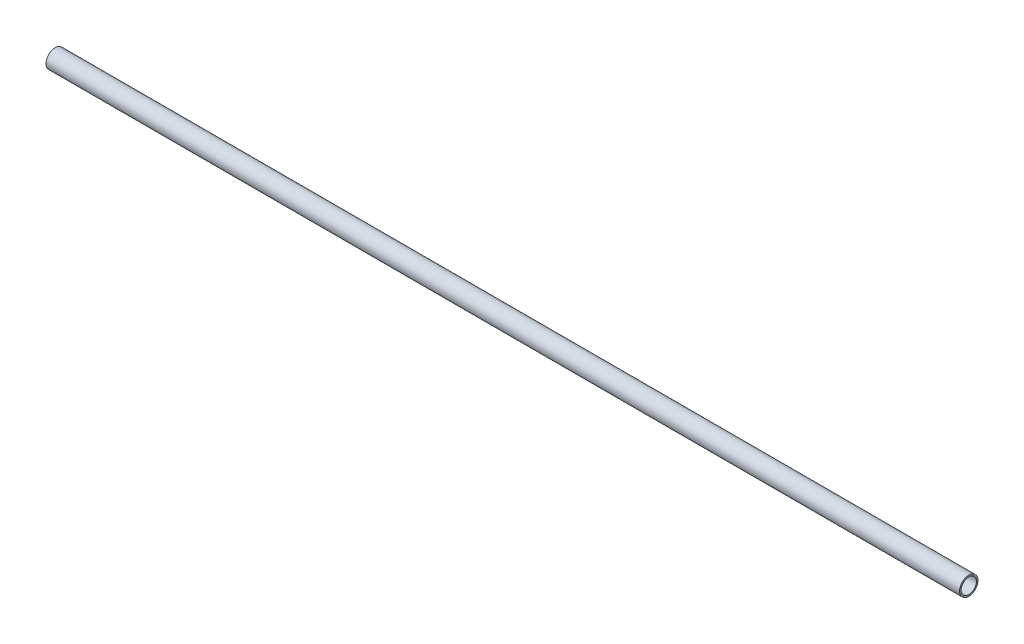
ISO-10303-21;
HEADER;
FILE_DESCRIPTION(('STEP AP214'),'2;1');
FILE_NAME('part.step','',(''),(''),'','','');
FILE_SCHEMA(('AUTOMOTIVE_DESIGN { 1 0 10303 214 1 1 1 1 }'));
ENDSEC;
DATA;
#1=APPLICATION_CONTEXT('core data for automotive mechanical design processes');
#2=APPLICATION_PROTOCOL_DEFINITION('international standard','automotive_design',2000,#1);
#3=PRODUCT_CONTEXT('',#1,'mechanical');
#4=PRODUCT('Part','Part','',(#3));
#5=PRODUCT_RELATED_PRODUCT_CATEGORY('part','',(#4));
#6=PRODUCT_DEFINITION_FORMATION('','',#4);
#7=PRODUCT_DEFINITION_CONTEXT('part definition',#1,'design');
#8=PRODUCT_DEFINITION('design','',#6,#7);
#9=PRODUCT_DEFINITION_SHAPE('','',#8);
#10=(LENGTH_UNIT() NAMED_UNIT(*) SI_UNIT(.MILLI.,.METRE.));
#11=(NAMED_UNIT(*) PLANE_ANGLE_UNIT() SI_UNIT($,.RADIAN.));
#12=(NAMED_UNIT(*) SI_UNIT($,.STERADIAN.) SOLID_ANGLE_UNIT());
#13=UNCERTAINTY_MEASURE_WITH_UNIT(LENGTH_MEASURE(1.E-05),#10,'distance_accuracy_value','');
#14=(GEOMETRIC_REPRESENTATION_CONTEXT(3) GLOBAL_UNCERTAINTY_ASSIGNED_CONTEXT((#13)) GLOBAL_UNIT_ASSIGNED_CONTEXT((#10,
#11,#12)) REPRESENTATION_CONTEXT('',''));
#15=CARTESIAN_POINT('',(0.,0.,0.));
#16=DIRECTION('',(0.,0.,1.));
#17=DIRECTION('',(1.,0.,0.));
#18=AXIS2_PLACEMENT_3D('',#15,#16,#17);
#19=CARTESIAN_POINT('',(1892.3,0.,0.));
#20=DIRECTION('',(1.,0.,0.));
#21=DIRECTION('',(0.,0.,-1.));
#22=AXIS2_PLACEMENT_3D('',#19,#20,#21);
#23=PLANE('',#22);
#24=CARTESIAN_POINT('',(1892.3,0.,0.));
#25=DIRECTION('',(1.,0.,0.));
#26=DIRECTION('',(0.,0.,-1.));
#27=AXIS2_PLACEMENT_3D('',#24,#25,#26);
#28=CIRCLE('',#27,19.05);
#29=CARTESIAN_POINT('',(1892.3,0.,-19.05));
#30=VERTEX_POINT('',#29);
#31=EDGE_CURVE('E10',#30,#30,#28,.T.);
#32=ORIENTED_EDGE('',*,*,#31,.T.);
#33=EDGE_LOOP('',(#32));
#34=FACE_BOUND('',#33,.T.);
#35=CARTESIAN_POINT('',(1892.3,0.,0.));
#36=DIRECTION('',(1.,0.,0.));
#37=DIRECTION('',(0.,0.,-1.));
#38=AXIS2_PLACEMENT_3D('',#35,#36,#37);
#39=CIRCLE('',#38,15.875);
#40=CARTESIAN_POINT('',(1892.3,0.,-15.875));
#41=VERTEX_POINT('',#40);
#42=EDGE_CURVE('E41',#41,#41,#39,.T.);
#43=ORIENTED_EDGE('',*,*,#42,.F.);
#44=EDGE_LOOP('',(#43));
#45=FACE_BOUND('',#44,.T.);
#46=ADVANCED_FACE('F30',(#34,#45),#23,.T.);
#47=CARTESIAN_POINT('',(0.,0.,0.));
#48=DIRECTION('',(1.,0.,0.));
#49=DIRECTION('',(0.,0.,-1.));
#50=AXIS2_PLACEMENT_3D('',#47,#48,#49);
#51=PLANE('',#50);
#52=CARTESIAN_POINT('',(0.,0.,0.));
#53=DIRECTION('',(1.,0.,0.));
#54=DIRECTION('',(0.,0.,-1.));
#55=AXIS2_PLACEMENT_3D('',#52,#53,#54);
#56=CIRCLE('',#55,19.05);
#57=CARTESIAN_POINT('',(0.,0.,-19.05));
#58=VERTEX_POINT('',#57);
#59=EDGE_CURVE('E34',#58,#58,#56,.T.);
#60=ORIENTED_EDGE('',*,*,#59,.F.);
#61=EDGE_LOOP('',(#60));
#62=FACE_BOUND('',#61,.T.);
#63=CARTESIAN_POINT('',(0.,0.,0.));
#64=DIRECTION('',(1.,0.,0.));
#65=DIRECTION('',(0.,0.,-1.));
#66=AXIS2_PLACEMENT_3D('',#63,#64,#65);
#67=CIRCLE('',#66,15.875);
#68=CARTESIAN_POINT('',(0.,0.,-15.875));
#69=VERTEX_POINT('',#68);
#70=EDGE_CURVE('E43',#69,#69,#67,.T.);
#71=ORIENTED_EDGE('',*,*,#70,.T.);
#72=EDGE_LOOP('',(#71));
#73=FACE_BOUND('',#72,.T.);
#74=ADVANCED_FACE('F53',(#62,#73),#51,.F.);
#75=CARTESIAN_POINT('',(1892.3,0.,0.));
#76=DIRECTION('',(-1.,0.,0.));
#77=DIRECTION('',(0.,0.,1.));
#78=AXIS2_PLACEMENT_3D('',#75,#76,#77);
#79=CYLINDRICAL_SURFACE('',#78,19.05);
#80=ORIENTED_EDGE('',*,*,#31,.F.);
#81=EDGE_LOOP('',(#80));
#82=FACE_BOUND('',#81,.T.);
#83=ORIENTED_EDGE('',*,*,#59,.T.);
#84=EDGE_LOOP('',(#83));
#85=FACE_BOUND('',#84,.T.);
#86=ADVANCED_FACE('F32',(#82,#85),#79,.T.);
#87=CARTESIAN_POINT('',(1892.3,0.,0.));
#88=DIRECTION('',(-1.,0.,0.));
#89=DIRECTION('',(0.,0.,1.));
#90=AXIS2_PLACEMENT_3D('',#87,#88,#89);
#91=CYLINDRICAL_SURFACE('',#90,15.875);
#92=ORIENTED_EDGE('',*,*,#42,.T.);
#93=EDGE_LOOP('',(#92));
#94=FACE_BOUND('',#93,.T.);
#95=ORIENTED_EDGE('',*,*,#70,.F.);
#96=EDGE_LOOP('',(#95));
#97=FACE_BOUND('',#96,.T.);
#98=ADVANCED_FACE('F49',(#94,#97),#91,.F.);
#99=CLOSED_SHELL('',(#46,#74,#86,#98));
#100=MANIFOLD_SOLID_BREP('B2',#99);
#101=ADVANCED_BREP_SHAPE_REPRESENTATION('',(#18,#100),#14);
#102=SHAPE_DEFINITION_REPRESENTATION(#9,#101);
ENDSEC;
END-ISO-10303-21;
